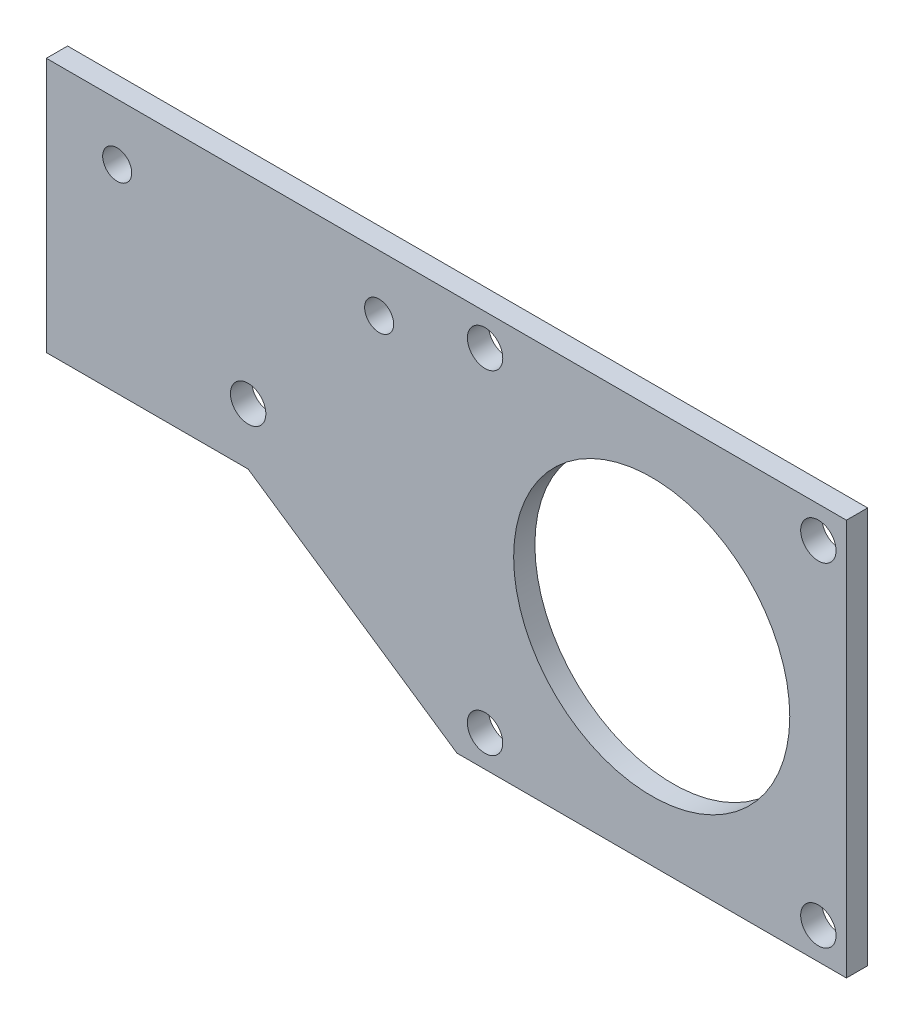
ISO-10303-21;
HEADER;
FILE_DESCRIPTION(('STEP AP214'),'2;1');
FILE_NAME('part.step','',(''),(''),'','','');
FILE_SCHEMA(('AUTOMOTIVE_DESIGN { 1 0 10303 214 1 1 1 1 }'));
ENDSEC;
DATA;
#1=APPLICATION_CONTEXT('core data for automotive mechanical design processes');
#2=APPLICATION_PROTOCOL_DEFINITION('international standard','automotive_design',2000,#1);
#3=PRODUCT_CONTEXT('',#1,'mechanical');
#4=PRODUCT('Part','Part','',(#3));
#5=PRODUCT_RELATED_PRODUCT_CATEGORY('part','',(#4));
#6=PRODUCT_DEFINITION_FORMATION('','',#4);
#7=PRODUCT_DEFINITION_CONTEXT('part definition',#1,'design');
#8=PRODUCT_DEFINITION('design','',#6,#7);
#9=PRODUCT_DEFINITION_SHAPE('','',#8);
#10=(LENGTH_UNIT() NAMED_UNIT(*) SI_UNIT(.MILLI.,.METRE.));
#11=(NAMED_UNIT(*) PLANE_ANGLE_UNIT() SI_UNIT($,.RADIAN.));
#12=(NAMED_UNIT(*) SI_UNIT($,.STERADIAN.) SOLID_ANGLE_UNIT());
#13=UNCERTAINTY_MEASURE_WITH_UNIT(LENGTH_MEASURE(1.E-05),#10,'distance_accuracy_value','');
#14=(GEOMETRIC_REPRESENTATION_CONTEXT(3) GLOBAL_UNCERTAINTY_ASSIGNED_CONTEXT((#13)) GLOBAL_UNIT_ASSIGNED_CONTEXT((#10,
#11,#12)) REPRESENTATION_CONTEXT('',''));
#15=CARTESIAN_POINT('',(0.,0.,0.));
#16=DIRECTION('',(0.,0.,1.));
#17=DIRECTION('',(1.,0.,0.));
#18=AXIS2_PLACEMENT_3D('',#15,#16,#17);
#19=CARTESIAN_POINT('',(0.,0.,3.));
#20=DIRECTION('',(0.,0.,1.));
#21=DIRECTION('',(1.,0.,0.));
#22=AXIS2_PLACEMENT_3D('',#19,#20,#21);
#23=PLANE('',#22);
#24=CARTESIAN_POINT('',(61.9600002014554,4.45993612202748,3.));
#25=DIRECTION('',(0.,0.,1.));
#26=DIRECTION('',(1.,0.,0.));
#27=AXIS2_PLACEMENT_3D('',#24,#25,#26);
#28=CIRCLE('',#27,2.5);
#29=CARTESIAN_POINT('',(64.4600002014554,4.45993612202748,3.));
#30=VERTEX_POINT('',#29);
#31=EDGE_CURVE('E175',#30,#30,#28,.T.);
#32=ORIENTED_EDGE('',*,*,#31,.F.);
#33=EDGE_LOOP('',(#32));
#34=FACE_BOUND('',#33,.T.);
#35=CARTESIAN_POINT('',(109.037164582365,4.45710104829562,3.));
#36=DIRECTION('',(0.,0.,1.));
#37=DIRECTION('',(1.,0.,0.));
#38=AXIS2_PLACEMENT_3D('',#35,#36,#37);
#39=CIRCLE('',#38,2.5);
#40=CARTESIAN_POINT('',(111.537164582365,4.45710104829562,3.));
#41=VERTEX_POINT('',#40);
#42=EDGE_CURVE('E165',#41,#41,#39,.T.);
#43=ORIENTED_EDGE('',*,*,#42,.F.);
#44=EDGE_LOOP('',(#43));
#45=FACE_BOUND('',#44,.T.);
#46=CARTESIAN_POINT('',(61.9628352751873,51.5371005029361,3.));
#47=DIRECTION('',(0.,0.,1.));
#48=DIRECTION('',(1.,0.,0.));
#49=AXIS2_PLACEMENT_3D('',#46,#47,#48);
#50=CIRCLE('',#49,2.5);
#51=CARTESIAN_POINT('',(64.4628352751873,51.5371005029361,3.));
#52=VERTEX_POINT('',#51);
#53=EDGE_CURVE('E162',#52,#52,#50,.T.);
#54=ORIENTED_EDGE('',*,*,#53,.F.);
#55=EDGE_LOOP('',(#54));
#56=FACE_BOUND('',#55,.T.);
#57=CARTESIAN_POINT('',(109.039999656097,51.5342654292048,3.));
#58=DIRECTION('',(0.,0.,1.));
#59=DIRECTION('',(1.,0.,0.));
#60=AXIS2_PLACEMENT_3D('',#57,#58,#59);
#61=CIRCLE('',#60,2.50000000000001);
#62=CARTESIAN_POINT('',(111.539999656097,51.5342654292048,3.));
#63=VERTEX_POINT('',#62);
#64=EDGE_CURVE('E159',#63,#63,#61,.T.);
#65=ORIENTED_EDGE('',*,*,#64,.F.);
#66=EDGE_LOOP('',(#65));
#67=FACE_BOUND('',#66,.T.);
#68=CARTESIAN_POINT('',(85.4999999287754,27.9971007756157,3.));
#69=DIRECTION('',(0.,0.,1.));
#70=DIRECTION('',(1.,0.,0.));
#71=AXIS2_PLACEMENT_3D('',#68,#69,#70);
#72=CIRCLE('',#71,19.5);
#73=CARTESIAN_POINT('',(104.999999928775,27.9971007756157,3.));
#74=VERTEX_POINT('',#73);
#75=EDGE_CURVE('E155',#74,#74,#72,.T.);
#76=ORIENTED_EDGE('',*,*,#75,.F.);
#77=EDGE_LOOP('',(#76));
#78=FACE_BOUND('',#77,.T.);
#79=CARTESIAN_POINT('',(10.0012045028537,48.0016474881844,3.));
#80=DIRECTION('',(0.,0.,1.));
#81=DIRECTION('',(1.,0.,0.));
#82=AXIS2_PLACEMENT_3D('',#79,#80,#81);
#83=CIRCLE('',#82,2.05000000000001);
#84=CARTESIAN_POINT('',(12.0512045028537,48.0016474881844,3.));
#85=VERTEX_POINT('',#84);
#86=EDGE_CURVE('E184',#85,#85,#83,.T.);
#87=ORIENTED_EDGE('',*,*,#86,.F.);
#88=EDGE_LOOP('',(#87));
#89=FACE_BOUND('',#88,.T.);
#90=CARTESIAN_POINT('',(47.0012044357603,47.999419280701,3.));
#91=DIRECTION('',(0.,0.,1.));
#92=DIRECTION('',(1.,0.,0.));
#93=AXIS2_PLACEMENT_3D('',#90,#91,#92);
#94=CIRCLE('',#93,2.05000000000001);
#95=CARTESIAN_POINT('',(49.0512044357603,47.999419280701,3.));
#96=VERTEX_POINT('',#95);
#97=EDGE_CURVE('E124',#96,#96,#94,.T.);
#98=ORIENTED_EDGE('',*,*,#97,.F.);
#99=EDGE_LOOP('',(#98));
#100=FACE_BOUND('',#99,.T.);
#101=DIRECTION('',(-1.,0.,0.));
#102=VECTOR('',#101,1.);
#103=CARTESIAN_POINT('',(28.5,20.,3.));
#104=LINE('',#103,#102);
#105=CARTESIAN_POINT('',(28.5,20.,3.));
#106=VERTEX_POINT('',#105);
#107=CARTESIAN_POINT('',(0.,20.,3.));
#108=VERTEX_POINT('',#107);
#109=EDGE_CURVE('E120',#106,#108,#104,.T.);
#110=ORIENTED_EDGE('',*,*,#109,.F.);
#111=DIRECTION('',(-0.827708498204769,0.56115830386764,0.));
#112=VECTOR('',#111,1.);
#113=CARTESIAN_POINT('',(58.,0.,3.));
#114=LINE('',#113,#112);
#115=CARTESIAN_POINT('',(58.,0.,3.));
#116=VERTEX_POINT('',#115);
#117=EDGE_CURVE('E100',#116,#106,#114,.T.);
#118=ORIENTED_EDGE('',*,*,#117,.F.);
#119=DIRECTION('',(1.,0.,0.));
#120=VECTOR('',#119,1.);
#121=CARTESIAN_POINT('',(0.,0.,3.));
#122=LINE('',#121,#120);
#123=CARTESIAN_POINT('',(113.,0.,3.));
#124=VERTEX_POINT('',#123);
#125=EDGE_CURVE('E83',#116,#124,#122,.T.);
#126=ORIENTED_EDGE('',*,*,#125,.T.);
#127=DIRECTION('',(0.,1.,0.));
#128=VECTOR('',#127,1.);
#129=CARTESIAN_POINT('',(113.,56.,3.));
#130=LINE('',#129,#128);
#131=CARTESIAN_POINT('',(113.,56.,3.));
#132=VERTEX_POINT('',#131);
#133=EDGE_CURVE('E140',#124,#132,#130,.T.);
#134=ORIENTED_EDGE('',*,*,#133,.T.);
#135=DIRECTION('',(-1.,0.,0.));
#136=VECTOR('',#135,1.);
#137=CARTESIAN_POINT('',(0.,56.,3.));
#138=LINE('',#137,#136);
#139=CARTESIAN_POINT('',(0.,56.,3.));
#140=VERTEX_POINT('',#139);
#141=EDGE_CURVE('E61',#132,#140,#138,.T.);
#142=ORIENTED_EDGE('',*,*,#141,.T.);
#143=DIRECTION('',(0.,-1.,0.));
#144=VECTOR('',#143,1.);
#145=CARTESIAN_POINT('',(0.,56.,3.));
#146=LINE('',#145,#144);
#147=EDGE_CURVE('E137',#140,#108,#146,.T.);
#148=ORIENTED_EDGE('',*,*,#147,.T.);
#149=EDGE_LOOP('',(#110,#118,#126,#134,#142,#148));
#150=FACE_BOUND('',#149,.T.);
#151=CARTESIAN_POINT('',(28.5,28.,3.));
#152=DIRECTION('',(0.,0.,1.));
#153=DIRECTION('',(1.,0.,0.));
#154=AXIS2_PLACEMENT_3D('',#151,#152,#153);
#155=CIRCLE('',#154,2.5);
#156=CARTESIAN_POINT('',(31.,28.,3.));
#157=VERTEX_POINT('',#156);
#158=EDGE_CURVE('E131',#157,#157,#155,.T.);
#159=ORIENTED_EDGE('',*,*,#158,.F.);
#160=EDGE_LOOP('',(#159));
#161=FACE_BOUND('',#160,.T.);
#162=ADVANCED_FACE('F35',(#34,#45,#56,#67,#78,#89,#100,#150,#161),#23,.T.);
#163=CARTESIAN_POINT('',(0.,0.,0.));
#164=DIRECTION('',(0.,0.,1.));
#165=DIRECTION('',(1.,0.,0.));
#166=AXIS2_PLACEMENT_3D('',#163,#164,#165);
#167=PLANE('',#166);
#168=CARTESIAN_POINT('',(61.9600002014554,4.45993612202748,0.));
#169=DIRECTION('',(0.,0.,1.));
#170=DIRECTION('',(1.,0.,0.));
#171=AXIS2_PLACEMENT_3D('',#168,#169,#170);
#172=CIRCLE('',#171,2.5);
#173=CARTESIAN_POINT('',(64.4600002014554,4.45993612202748,0.));
#174=VERTEX_POINT('',#173);
#175=EDGE_CURVE('E39',#174,#174,#172,.T.);
#176=ORIENTED_EDGE('',*,*,#175,.T.);
#177=EDGE_LOOP('',(#176));
#178=FACE_BOUND('',#177,.T.);
#179=CARTESIAN_POINT('',(109.037164582365,4.45710104829562,0.));
#180=DIRECTION('',(0.,0.,1.));
#181=DIRECTION('',(1.,0.,0.));
#182=AXIS2_PLACEMENT_3D('',#179,#180,#181);
#183=CIRCLE('',#182,2.5);
#184=CARTESIAN_POINT('',(111.537164582365,4.45710104829562,0.));
#185=VERTEX_POINT('',#184);
#186=EDGE_CURVE('E163',#185,#185,#183,.T.);
#187=ORIENTED_EDGE('',*,*,#186,.T.);
#188=EDGE_LOOP('',(#187));
#189=FACE_BOUND('',#188,.T.);
#190=CARTESIAN_POINT('',(61.9628352751873,51.5371005029361,0.));
#191=DIRECTION('',(0.,0.,1.));
#192=DIRECTION('',(1.,0.,0.));
#193=AXIS2_PLACEMENT_3D('',#190,#191,#192);
#194=CIRCLE('',#193,2.5);
#195=CARTESIAN_POINT('',(64.4628352751873,51.5371005029361,0.));
#196=VERTEX_POINT('',#195);
#197=EDGE_CURVE('E160',#196,#196,#194,.T.);
#198=ORIENTED_EDGE('',*,*,#197,.T.);
#199=EDGE_LOOP('',(#198));
#200=FACE_BOUND('',#199,.T.);
#201=CARTESIAN_POINT('',(109.039999656097,51.5342654292048,0.));
#202=DIRECTION('',(0.,0.,1.));
#203=DIRECTION('',(1.,0.,0.));
#204=AXIS2_PLACEMENT_3D('',#201,#202,#203);
#205=CIRCLE('',#204,2.50000000000001);
#206=CARTESIAN_POINT('',(111.539999656097,51.5342654292048,0.));
#207=VERTEX_POINT('',#206);
#208=EDGE_CURVE('E156',#207,#207,#205,.T.);
#209=ORIENTED_EDGE('',*,*,#208,.T.);
#210=EDGE_LOOP('',(#209));
#211=FACE_BOUND('',#210,.T.);
#212=CARTESIAN_POINT('',(85.4999999287754,27.9971007756157,0.));
#213=DIRECTION('',(0.,0.,1.));
#214=DIRECTION('',(1.,0.,0.));
#215=AXIS2_PLACEMENT_3D('',#212,#213,#214);
#216=CIRCLE('',#215,19.5);
#217=CARTESIAN_POINT('',(104.999999928775,27.9971007756157,0.));
#218=VERTEX_POINT('',#217);
#219=EDGE_CURVE('E151',#218,#218,#216,.T.);
#220=ORIENTED_EDGE('',*,*,#219,.T.);
#221=EDGE_LOOP('',(#220));
#222=FACE_BOUND('',#221,.T.);
#223=CARTESIAN_POINT('',(10.0012045028537,48.0016474881844,0.));
#224=DIRECTION('',(0.,0.,-1.));
#225=DIRECTION('',(-1.,0.,0.));
#226=AXIS2_PLACEMENT_3D('',#223,#224,#225);
#227=CIRCLE('',#226,2.05000000000001);
#228=CARTESIAN_POINT('',(7.9512045028537,48.0016474881844,0.));
#229=VERTEX_POINT('',#228);
#230=EDGE_CURVE('E154',#229,#229,#227,.T.);
#231=ORIENTED_EDGE('',*,*,#230,.F.);
#232=EDGE_LOOP('',(#231));
#233=FACE_BOUND('',#232,.T.);
#234=CARTESIAN_POINT('',(47.0012044357603,47.999419280701,0.));
#235=DIRECTION('',(0.,0.,-1.));
#236=DIRECTION('',(-1.,0.,0.));
#237=AXIS2_PLACEMENT_3D('',#234,#235,#236);
#238=CIRCLE('',#237,2.05000000000001);
#239=CARTESIAN_POINT('',(44.9512044357603,47.999419280701,0.));
#240=VERTEX_POINT('',#239);
#241=EDGE_CURVE('E186',#240,#240,#238,.T.);
#242=ORIENTED_EDGE('',*,*,#241,.F.);
#243=EDGE_LOOP('',(#242));
#244=FACE_BOUND('',#243,.T.);
#245=DIRECTION('',(-0.827708498204769,0.56115830386764,0.));
#246=VECTOR('',#245,1.);
#247=CARTESIAN_POINT('',(58.,0.,0.));
#248=LINE('',#247,#246);
#249=CARTESIAN_POINT('',(58.,0.,0.));
#250=VERTEX_POINT('',#249);
#251=CARTESIAN_POINT('',(28.5,20.,0.));
#252=VERTEX_POINT('',#251);
#253=EDGE_CURVE('E52',#250,#252,#248,.T.);
#254=ORIENTED_EDGE('',*,*,#253,.T.);
#255=DIRECTION('',(-1.,0.,0.));
#256=VECTOR('',#255,1.);
#257=CARTESIAN_POINT('',(28.5,20.,0.));
#258=LINE('',#257,#256);
#259=CARTESIAN_POINT('',(0.,20.,0.));
#260=VERTEX_POINT('',#259);
#261=EDGE_CURVE('E109',#252,#260,#258,.T.);
#262=ORIENTED_EDGE('',*,*,#261,.T.);
#263=DIRECTION('',(0.,-1.,0.));
#264=VECTOR('',#263,1.);
#265=CARTESIAN_POINT('',(0.,56.,0.));
#266=LINE('',#265,#264);
#267=CARTESIAN_POINT('',(0.,56.,0.));
#268=VERTEX_POINT('',#267);
#269=EDGE_CURVE('E134',#268,#260,#266,.T.);
#270=ORIENTED_EDGE('',*,*,#269,.F.);
#271=DIRECTION('',(-1.,0.,0.));
#272=VECTOR('',#271,1.);
#273=CARTESIAN_POINT('',(0.,56.,0.));
#274=LINE('',#273,#272);
#275=CARTESIAN_POINT('',(113.,56.,0.));
#276=VERTEX_POINT('',#275);
#277=EDGE_CURVE('E78',#276,#268,#274,.T.);
#278=ORIENTED_EDGE('',*,*,#277,.F.);
#279=DIRECTION('',(0.,1.,0.));
#280=VECTOR('',#279,1.);
#281=CARTESIAN_POINT('',(113.,56.,0.));
#282=LINE('',#281,#280);
#283=CARTESIAN_POINT('',(113.,0.,0.));
#284=VERTEX_POINT('',#283);
#285=EDGE_CURVE('E146',#284,#276,#282,.T.);
#286=ORIENTED_EDGE('',*,*,#285,.F.);
#287=DIRECTION('',(1.,0.,0.));
#288=VECTOR('',#287,1.);
#289=CARTESIAN_POINT('',(0.,0.,0.));
#290=LINE('',#289,#288);
#291=EDGE_CURVE('E119',#250,#284,#290,.T.);
#292=ORIENTED_EDGE('',*,*,#291,.F.);
#293=EDGE_LOOP('',(#254,#262,#270,#278,#286,#292));
#294=FACE_BOUND('',#293,.T.);
#295=CARTESIAN_POINT('',(28.5,28.,0.));
#296=DIRECTION('',(0.,0.,1.));
#297=DIRECTION('',(1.,0.,0.));
#298=AXIS2_PLACEMENT_3D('',#295,#296,#297);
#299=CIRCLE('',#298,2.5);
#300=CARTESIAN_POINT('',(31.,28.,0.));
#301=VERTEX_POINT('',#300);
#302=EDGE_CURVE('E128',#301,#301,#299,.T.);
#303=ORIENTED_EDGE('',*,*,#302,.T.);
#304=EDGE_LOOP('',(#303));
#305=FACE_BOUND('',#304,.T.);
#306=ADVANCED_FACE('F116',(#178,#189,#200,#211,#222,#233,#244,#294,#305),#167,.F.);
#307=CARTESIAN_POINT('',(0.,56.,3.));
#308=DIRECTION('',(1.,0.,0.));
#309=DIRECTION('',(0.,1.,0.));
#310=AXIS2_PLACEMENT_3D('',#307,#308,#309);
#311=PLANE('',#310);
#312=ORIENTED_EDGE('',*,*,#269,.T.);
#313=DIRECTION('',(0.,0.,1.));
#314=VECTOR('',#313,1.);
#315=CARTESIAN_POINT('',(0.,20.,0.));
#316=LINE('',#315,#314);
#317=EDGE_CURVE('E104',#260,#108,#316,.T.);
#318=ORIENTED_EDGE('',*,*,#317,.T.);
#319=ORIENTED_EDGE('',*,*,#147,.F.);
#320=DIRECTION('',(0.,0.,-1.));
#321=VECTOR('',#320,1.);
#322=CARTESIAN_POINT('',(0.,56.,3.));
#323=LINE('',#322,#321);
#324=EDGE_CURVE('E143',#140,#268,#323,.T.);
#325=ORIENTED_EDGE('',*,*,#324,.T.);
#326=EDGE_LOOP('',(#312,#318,#319,#325));
#327=FACE_BOUND('',#326,.T.);
#328=ADVANCED_FACE('F37',(#327),#311,.F.);
#329=CARTESIAN_POINT('',(0.,0.,3.));
#330=DIRECTION('',(0.,1.,0.));
#331=DIRECTION('',(0.,0.,1.));
#332=AXIS2_PLACEMENT_3D('',#329,#330,#331);
#333=PLANE('',#332);
#334=ORIENTED_EDGE('',*,*,#125,.F.);
#335=DIRECTION('',(0.,0.,1.));
#336=VECTOR('',#335,1.);
#337=CARTESIAN_POINT('',(58.,0.,0.));
#338=LINE('',#337,#336);
#339=EDGE_CURVE('E105',#250,#116,#338,.T.);
#340=ORIENTED_EDGE('',*,*,#339,.F.);
#341=ORIENTED_EDGE('',*,*,#291,.T.);
#342=DIRECTION('',(0.,0.,-1.));
#343=VECTOR('',#342,1.);
#344=CARTESIAN_POINT('',(113.,0.,3.));
#345=LINE('',#344,#343);
#346=EDGE_CURVE('E11',#124,#284,#345,.T.);
#347=ORIENTED_EDGE('',*,*,#346,.F.);
#348=EDGE_LOOP('',(#334,#340,#341,#347));
#349=FACE_BOUND('',#348,.T.);
#350=ADVANCED_FACE('F213',(#349),#333,.F.);
#351=CARTESIAN_POINT('',(113.,56.,3.));
#352=DIRECTION('',(-1.,0.,0.));
#353=DIRECTION('',(0.,0.,1.));
#354=AXIS2_PLACEMENT_3D('',#351,#352,#353);
#355=PLANE('',#354);
#356=ORIENTED_EDGE('',*,*,#285,.T.);
#357=DIRECTION('',(0.,0.,-1.));
#358=VECTOR('',#357,1.);
#359=CARTESIAN_POINT('',(113.,56.,3.));
#360=LINE('',#359,#358);
#361=EDGE_CURVE('E44',#132,#276,#360,.T.);
#362=ORIENTED_EDGE('',*,*,#361,.F.);
#363=ORIENTED_EDGE('',*,*,#133,.F.);
#364=ORIENTED_EDGE('',*,*,#346,.T.);
#365=EDGE_LOOP('',(#356,#362,#363,#364));
#366=FACE_BOUND('',#365,.T.);
#367=ADVANCED_FACE('F218',(#366),#355,.F.);
#368=CARTESIAN_POINT('',(0.,56.,3.));
#369=DIRECTION('',(0.,-1.,0.));
#370=DIRECTION('',(0.,0.,-1.));
#371=AXIS2_PLACEMENT_3D('',#368,#369,#370);
#372=PLANE('',#371);
#373=ORIENTED_EDGE('',*,*,#277,.T.);
#374=ORIENTED_EDGE('',*,*,#324,.F.);
#375=ORIENTED_EDGE('',*,*,#141,.F.);
#376=ORIENTED_EDGE('',*,*,#361,.T.);
#377=EDGE_LOOP('',(#373,#374,#375,#376));
#378=FACE_BOUND('',#377,.T.);
#379=ADVANCED_FACE('F204',(#378),#372,.F.);
#380=CARTESIAN_POINT('',(28.5,28.,3.));
#381=DIRECTION('',(0.,0.,-1.));
#382=DIRECTION('',(-1.,0.,0.));
#383=AXIS2_PLACEMENT_3D('',#380,#381,#382);
#384=CYLINDRICAL_SURFACE('',#383,2.5);
#385=ORIENTED_EDGE('',*,*,#158,.T.);
#386=EDGE_LOOP('',(#385));
#387=FACE_BOUND('',#386,.T.);
#388=ORIENTED_EDGE('',*,*,#302,.F.);
#389=EDGE_LOOP('',(#388));
#390=FACE_BOUND('',#389,.T.);
#391=ADVANCED_FACE('F201',(#387,#390),#384,.F.);
#392=CARTESIAN_POINT('',(28.5,20.,0.));
#393=DIRECTION('',(0.,1.,0.));
#394=DIRECTION('',(-1.,0.,0.));
#395=AXIS2_PLACEMENT_3D('',#392,#393,#394);
#396=PLANE('',#395);
#397=ORIENTED_EDGE('',*,*,#109,.T.);
#398=ORIENTED_EDGE('',*,*,#317,.F.);
#399=ORIENTED_EDGE('',*,*,#261,.F.);
#400=DIRECTION('',(0.,0.,1.));
#401=VECTOR('',#400,1.);
#402=CARTESIAN_POINT('',(28.5,20.,0.));
#403=LINE('',#402,#401);
#404=EDGE_CURVE('E97',#252,#106,#403,.T.);
#405=ORIENTED_EDGE('',*,*,#404,.T.);
#406=EDGE_LOOP('',(#397,#398,#399,#405));
#407=FACE_BOUND('',#406,.T.);
#408=ADVANCED_FACE('F110',(#407),#396,.F.);
#409=CARTESIAN_POINT('',(58.,0.,0.));
#410=DIRECTION('',(0.56115830386764,0.827708498204769,0.));
#411=DIRECTION('',(-0.827708498204769,0.56115830386764,0.));
#412=AXIS2_PLACEMENT_3D('',#409,#410,#411);
#413=PLANE('',#412);
#414=ORIENTED_EDGE('',*,*,#117,.T.);
#415=ORIENTED_EDGE('',*,*,#404,.F.);
#416=ORIENTED_EDGE('',*,*,#253,.F.);
#417=ORIENTED_EDGE('',*,*,#339,.T.);
#418=EDGE_LOOP('',(#414,#415,#416,#417));
#419=FACE_BOUND('',#418,.T.);
#420=ADVANCED_FACE('F99',(#419),#413,.F.);
#421=CARTESIAN_POINT('',(47.0012044357603,47.999419280701,10.));
#422=DIRECTION('',(0.,0.,-1.));
#423=DIRECTION('',(-1.,0.,0.));
#424=AXIS2_PLACEMENT_3D('',#421,#422,#423);
#425=CYLINDRICAL_SURFACE('',#424,2.05000000000001);
#426=ORIENTED_EDGE('',*,*,#97,.T.);
#427=EDGE_LOOP('',(#426));
#428=FACE_BOUND('',#427,.T.);
#429=ORIENTED_EDGE('',*,*,#241,.T.);
#430=EDGE_LOOP('',(#429));
#431=FACE_BOUND('',#430,.T.);
#432=ADVANCED_FACE('F193',(#428,#431),#425,.F.);
#433=CARTESIAN_POINT('',(10.0012045028537,48.0016474881844,10.));
#434=DIRECTION('',(0.,0.,-1.));
#435=DIRECTION('',(-1.,0.,0.));
#436=AXIS2_PLACEMENT_3D('',#433,#434,#435);
#437=CYLINDRICAL_SURFACE('',#436,2.05000000000001);
#438=ORIENTED_EDGE('',*,*,#86,.T.);
#439=EDGE_LOOP('',(#438));
#440=FACE_BOUND('',#439,.T.);
#441=ORIENTED_EDGE('',*,*,#230,.T.);
#442=EDGE_LOOP('',(#441));
#443=FACE_BOUND('',#442,.T.);
#444=ADVANCED_FACE('F260',(#440,#443),#437,.F.);
#445=CARTESIAN_POINT('',(85.4999999287754,27.9971007756157,-7.));
#446=DIRECTION('',(0.,0.,1.));
#447=DIRECTION('',(1.,0.,0.));
#448=AXIS2_PLACEMENT_3D('',#445,#446,#447);
#449=CYLINDRICAL_SURFACE('',#448,19.5);
#450=ORIENTED_EDGE('',*,*,#75,.T.);
#451=EDGE_LOOP('',(#450));
#452=FACE_BOUND('',#451,.T.);
#453=ORIENTED_EDGE('',*,*,#219,.F.);
#454=EDGE_LOOP('',(#453));
#455=FACE_BOUND('',#454,.T.);
#456=ADVANCED_FACE('F267',(#452,#455),#449,.F.);
#457=CARTESIAN_POINT('',(109.039999656097,51.5342654292048,-7.));
#458=DIRECTION('',(0.,0.,1.));
#459=DIRECTION('',(1.,0.,0.));
#460=AXIS2_PLACEMENT_3D('',#457,#458,#459);
#461=CYLINDRICAL_SURFACE('',#460,2.50000000000001);
#462=ORIENTED_EDGE('',*,*,#64,.T.);
#463=EDGE_LOOP('',(#462));
#464=FACE_BOUND('',#463,.T.);
#465=ORIENTED_EDGE('',*,*,#208,.F.);
#466=EDGE_LOOP('',(#465));
#467=FACE_BOUND('',#466,.T.);
#468=ADVANCED_FACE('F276',(#464,#467),#461,.F.);
#469=CARTESIAN_POINT('',(61.9628352751873,51.5371005029361,-7.));
#470=DIRECTION('',(0.,0.,1.));
#471=DIRECTION('',(1.,0.,0.));
#472=AXIS2_PLACEMENT_3D('',#469,#470,#471);
#473=CYLINDRICAL_SURFACE('',#472,2.5);
#474=ORIENTED_EDGE('',*,*,#53,.T.);
#475=EDGE_LOOP('',(#474));
#476=FACE_BOUND('',#475,.T.);
#477=ORIENTED_EDGE('',*,*,#197,.F.);
#478=EDGE_LOOP('',(#477));
#479=FACE_BOUND('',#478,.T.);
#480=ADVANCED_FACE('F284',(#476,#479),#473,.F.);
#481=CARTESIAN_POINT('',(109.037164582365,4.45710104829562,-7.));
#482=DIRECTION('',(0.,0.,1.));
#483=DIRECTION('',(1.,0.,0.));
#484=AXIS2_PLACEMENT_3D('',#481,#482,#483);
#485=CYLINDRICAL_SURFACE('',#484,2.5);
#486=ORIENTED_EDGE('',*,*,#42,.T.);
#487=EDGE_LOOP('',(#486));
#488=FACE_BOUND('',#487,.T.);
#489=ORIENTED_EDGE('',*,*,#186,.F.);
#490=EDGE_LOOP('',(#489));
#491=FACE_BOUND('',#490,.T.);
#492=ADVANCED_FACE('F292',(#488,#491),#485,.F.);
#493=CARTESIAN_POINT('',(61.9600002014554,4.45993612202748,-7.));
#494=DIRECTION('',(0.,0.,1.));
#495=DIRECTION('',(1.,0.,0.));
#496=AXIS2_PLACEMENT_3D('',#493,#494,#495);
#497=CYLINDRICAL_SURFACE('',#496,2.5);
#498=ORIENTED_EDGE('',*,*,#31,.T.);
#499=EDGE_LOOP('',(#498));
#500=FACE_BOUND('',#499,.T.);
#501=ORIENTED_EDGE('',*,*,#175,.F.);
#502=EDGE_LOOP('',(#501));
#503=FACE_BOUND('',#502,.T.);
#504=ADVANCED_FACE('F300',(#500,#503),#497,.F.);
#505=CLOSED_SHELL('',(#162,#306,#328,#350,#367,#379,#391,#408,#420,#432,#444,#456,#468,#480,
#492,#504));
#506=MANIFOLD_SOLID_BREP('B2',#505);
#507=ADVANCED_BREP_SHAPE_REPRESENTATION('',(#18,#506),#14);
#508=SHAPE_DEFINITION_REPRESENTATION(#9,#507);
ENDSEC;
END-ISO-10303-21;
